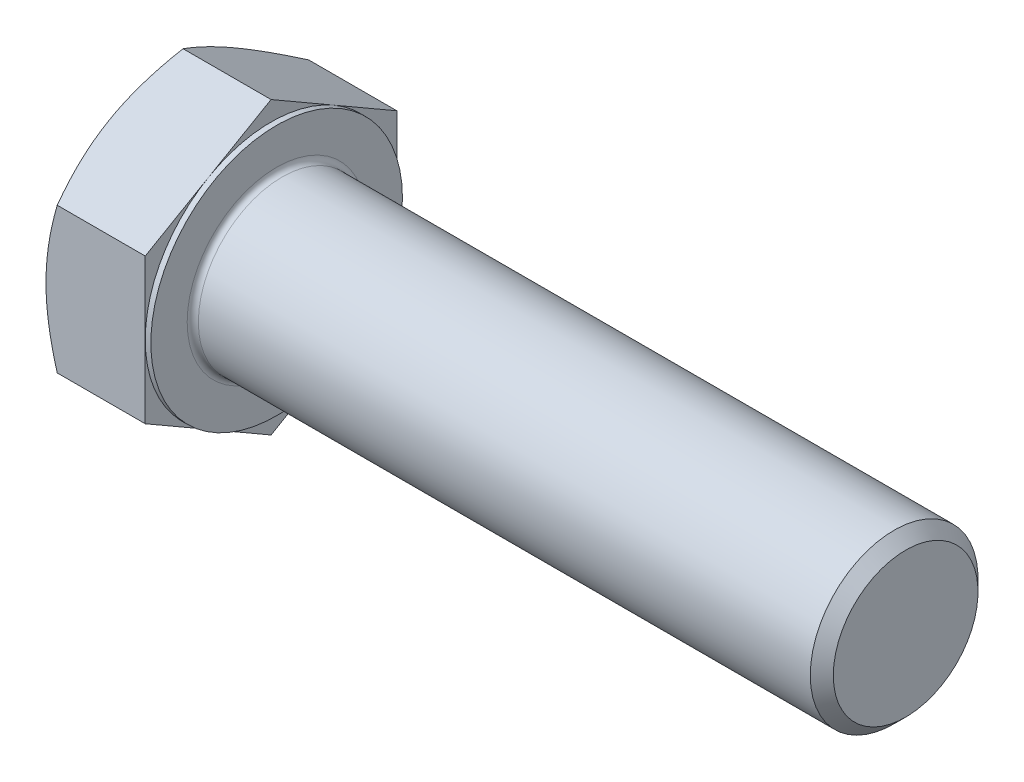
ISO-10303-21;
HEADER;
FILE_DESCRIPTION(('STEP AP214'),'2;1');
FILE_NAME('part.step','',(''),(''),'','','');
FILE_SCHEMA(('AUTOMOTIVE_DESIGN { 1 0 10303 214 1 1 1 1 }'));
ENDSEC;
DATA;
#1=APPLICATION_CONTEXT('core data for automotive mechanical design processes');
#2=APPLICATION_PROTOCOL_DEFINITION('international standard','automotive_design',2000,#1);
#3=PRODUCT_CONTEXT('',#1,'mechanical');
#4=PRODUCT('Part','Part','',(#3));
#5=PRODUCT_RELATED_PRODUCT_CATEGORY('part','',(#4));
#6=PRODUCT_DEFINITION_FORMATION('','',#4);
#7=PRODUCT_DEFINITION_CONTEXT('part definition',#1,'design');
#8=PRODUCT_DEFINITION('design','',#6,#7);
#9=PRODUCT_DEFINITION_SHAPE('','',#8);
#10=(LENGTH_UNIT() NAMED_UNIT(*) SI_UNIT(.MILLI.,.METRE.));
#11=(NAMED_UNIT(*) PLANE_ANGLE_UNIT() SI_UNIT($,.RADIAN.));
#12=(NAMED_UNIT(*) SI_UNIT($,.STERADIAN.) SOLID_ANGLE_UNIT());
#13=UNCERTAINTY_MEASURE_WITH_UNIT(LENGTH_MEASURE(1.E-05),#10,'distance_accuracy_value','');
#14=(GEOMETRIC_REPRESENTATION_CONTEXT(3) GLOBAL_UNCERTAINTY_ASSIGNED_CONTEXT((#13)) GLOBAL_UNIT_ASSIGNED_CONTEXT((#10,
#11,#12)) REPRESENTATION_CONTEXT('',''));
#15=CARTESIAN_POINT('',(0.,0.,0.));
#16=DIRECTION('',(0.,0.,1.));
#17=DIRECTION('',(1.,0.,0.));
#18=AXIS2_PLACEMENT_3D('',#15,#16,#17);
#19=CARTESIAN_POINT('',(9.0556296058918,14.1078379607395,8.99237065564875));
#20=DIRECTION('',(1.,0.,0.));
#21=DIRECTION('',(0.,0.,-1.));
#22=AXIS2_PLACEMENT_3D('',#19,#20,#21);
#23=PLANE('',#22);
#24=CARTESIAN_POINT('',(9.0556296058918,11.5097617493862,8.99237065564875));
#25=DIRECTION('',(1.,0.,0.));
#26=DIRECTION('',(0.,0.,-1.));
#27=AXIS2_PLACEMENT_3D('',#24,#25,#26);
#28=CIRCLE('',#27,1.6);
#29=CARTESIAN_POINT('',(9.0556296058918,11.5097617493862,7.39237065564875));
#30=VERTEX_POINT('',#29);
#31=EDGE_CURVE('E45',#30,#30,#28,.F.);
#32=ORIENTED_EDGE('',*,*,#31,.T.);
#33=EDGE_LOOP('',(#32));
#34=FACE_BOUND('',#33,.T.);
#35=CARTESIAN_POINT('',(9.0556296058918,11.5097617493862,8.99237065564875));
#36=DIRECTION('',(1.,0.,0.));
#37=DIRECTION('',(0.,0.,-1.));
#38=AXIS2_PLACEMENT_3D('',#35,#36,#37);
#39=CIRCLE('',#38,2.25);
#40=CARTESIAN_POINT('',(9.0556296058918,11.5097617493862,6.74237065564875));
#41=VERTEX_POINT('',#40);
#42=EDGE_CURVE('E296',#41,#41,#39,.T.);
#43=ORIENTED_EDGE('',*,*,#42,.T.);
#44=EDGE_LOOP('',(#43));
#45=FACE_BOUND('',#44,.T.);
#46=ADVANCED_FACE('F37',(#34,#45),#23,.T.);
#47=CARTESIAN_POINT('',(7.1806296058918,11.5097617493862,8.99237065564875));
#48=DIRECTION('',(-1.,0.,0.));
#49=DIRECTION('',(0.,0.,1.));
#50=AXIS2_PLACEMENT_3D('',#47,#48,#49);
#51=CYLINDRICAL_SURFACE('',#50,1.5);
#52=CARTESIAN_POINT('',(9.15562960589179,11.5097617493862,8.99237065564875));
#53=DIRECTION('',(1.,0.,0.));
#54=DIRECTION('',(0.,0.,-1.));
#55=AXIS2_PLACEMENT_3D('',#52,#53,#54);
#56=CIRCLE('',#55,1.5);
#57=CARTESIAN_POINT('',(9.15562960589179,11.5097617493862,7.49237065564875));
#58=VERTEX_POINT('',#57);
#59=EDGE_CURVE('E11',#58,#58,#56,.T.);
#60=ORIENTED_EDGE('',*,*,#59,.T.);
#61=EDGE_LOOP('',(#60));
#62=FACE_BOUND('',#61,.T.);
#63=CARTESIAN_POINT('',(20.0996296058918,11.5097617493862,8.99237065564875));
#64=DIRECTION('',(-1.,0.,0.));
#65=DIRECTION('',(0.,0.,1.));
#66=AXIS2_PLACEMENT_3D('',#63,#64,#65);
#67=CIRCLE('',#66,1.5);
#68=CARTESIAN_POINT('',(20.0996296058918,11.5097617493862,10.4923706556488));
#69=VERTEX_POINT('',#68);
#70=EDGE_CURVE('E275',#69,#69,#67,.T.);
#71=ORIENTED_EDGE('',*,*,#70,.T.);
#72=EDGE_LOOP('',(#71));
#73=FACE_BOUND('',#72,.T.);
#74=ADVANCED_FACE('F249',(#62,#73),#51,.T.);
#75=CARTESIAN_POINT('',(20.3056296058918,11.5097617493862,8.99237065564875));
#76=DIRECTION('',(-1.,0.,0.));
#77=DIRECTION('',(0.,0.,1.));
#78=AXIS2_PLACEMENT_3D('',#75,#76,#77);
#79=CONICAL_SURFACE('',#78,1.294,0.785398163397449);
#80=ORIENTED_EDGE('',*,*,#70,.F.);
#81=EDGE_LOOP('',(#80));
#82=FACE_BOUND('',#81,.T.);
#83=CARTESIAN_POINT('',(20.3056296058918,11.5097617493862,8.99237065564875));
#84=DIRECTION('',(-1.,0.,0.));
#85=DIRECTION('',(0.,0.,1.));
#86=AXIS2_PLACEMENT_3D('',#83,#84,#85);
#87=CIRCLE('',#86,1.294);
#88=CARTESIAN_POINT('',(20.3056296058918,11.5097617493862,10.2863706556488));
#89=VERTEX_POINT('',#88);
#90=EDGE_CURVE('E273',#89,#89,#87,.T.);
#91=ORIENTED_EDGE('',*,*,#90,.T.);
#92=EDGE_LOOP('',(#91));
#93=FACE_BOUND('',#92,.T.);
#94=ADVANCED_FACE('F254',(#82,#93),#79,.T.);
#95=CARTESIAN_POINT('',(20.3056296058918,11.5097617493862,8.99237065564875));
#96=DIRECTION('',(-1.,0.,0.));
#97=DIRECTION('',(0.,0.,1.));
#98=AXIS2_PLACEMENT_3D('',#95,#96,#97);
#99=PLANE('',#98);
#100=ORIENTED_EDGE('',*,*,#90,.F.);
#101=EDGE_LOOP('',(#100));
#102=FACE_BOUND('',#101,.T.);
#103=ADVANCED_FACE('F261',(#102),#99,.F.);
#104=CARTESIAN_POINT('',(8.9556296058918,13.7597617493862,8.99237065564875));
#105=DIRECTION('',(1.,0.,0.));
#106=DIRECTION('',(0.,0.,-1.));
#107=AXIS2_PLACEMENT_3D('',#104,#105,#106);
#108=PLANE('',#107);
#109=DIRECTION('',(0.,0.500000000000001,0.866025403784438));
#110=VECTOR('',#109,1.);
#111=CARTESIAN_POINT('',(8.9556296058918,12.8087998550629,6.74237065564875));
#112=LINE('',#111,#110);
#113=CARTESIAN_POINT('',(8.9556296058918,12.8087998550629,6.74237065564875));
#114=VERTEX_POINT('',#113);
#115=CARTESIAN_POINT('',(8.9556296058918,13.4583189079012,7.86737065564875));
#116=VERTEX_POINT('',#115);
#117=EDGE_CURVE('E169',#114,#116,#112,.T.);
#118=ORIENTED_EDGE('',*,*,#117,.T.);
#119=CARTESIAN_POINT('',(8.9556296058918,11.5097617493862,8.99237065564875));
#120=DIRECTION('',(-1.,0.,0.));
#121=DIRECTION('',(0.,0.,1.));
#122=AXIS2_PLACEMENT_3D('',#119,#120,#121);
#123=CIRCLE('',#122,2.25);
#124=CARTESIAN_POINT('',(8.9556296058918,11.5097617493862,6.74237065564875));
#125=VERTEX_POINT('',#124);
#126=EDGE_CURVE('E52',#116,#125,#123,.T.);
#127=ORIENTED_EDGE('',*,*,#126,.T.);
#128=DIRECTION('',(0.,1.,0.));
#129=VECTOR('',#128,1.);
#130=CARTESIAN_POINT('',(8.9556296058918,12.8087998550629,6.74237065564875));
#131=LINE('',#130,#129);
#132=EDGE_CURVE('E299',#125,#114,#131,.T.);
#133=ORIENTED_EDGE('',*,*,#132,.T.);
#134=EDGE_LOOP('',(#118,#127,#133));
#135=FACE_BOUND('',#134,.T.);
#136=ADVANCED_FACE('F264',(#135),#108,.T.);
#137=CARTESIAN_POINT('',(8.9556296058918,14.1078379607395,8.99237065564875));
#138=VERTEX_POINT('',#137);
#139=EDGE_CURVE('E167',#116,#138,#112,.T.);
#140=ORIENTED_EDGE('',*,*,#139,.T.);
#141=DIRECTION('',(0.,-0.500000000000001,0.866025403784438));
#142=VECTOR('',#141,1.);
#143=CARTESIAN_POINT('',(8.9556296058918,14.1078379607395,8.99237065564875));
#144=LINE('',#143,#142);
#145=CARTESIAN_POINT('',(8.9556296058918,13.4583189079012,10.1173706556488));
#146=VERTEX_POINT('',#145);
#147=EDGE_CURVE('E166',#138,#146,#144,.T.);
#148=ORIENTED_EDGE('',*,*,#147,.T.);
#149=EDGE_CURVE('E155',#146,#116,#123,.T.);
#150=ORIENTED_EDGE('',*,*,#149,.T.);
#151=EDGE_LOOP('',(#140,#148,#150));
#152=FACE_BOUND('',#151,.T.);
#153=ADVANCED_FACE('F269',(#152),#108,.T.);
#154=CARTESIAN_POINT('',(8.9556296058918,12.8087998550629,11.2423706556488));
#155=VERTEX_POINT('',#154);
#156=EDGE_CURVE('E134',#146,#155,#144,.T.);
#157=ORIENTED_EDGE('',*,*,#156,.T.);
#158=DIRECTION('',(0.,-1.,0.));
#159=VECTOR('',#158,1.);
#160=CARTESIAN_POINT('',(8.9556296058918,12.8087998550629,11.2423706556488));
#161=LINE('',#160,#159);
#162=CARTESIAN_POINT('',(8.9556296058918,11.5097617493862,11.2423706556488));
#163=VERTEX_POINT('',#162);
#164=EDGE_CURVE('E128',#155,#163,#161,.T.);
#165=ORIENTED_EDGE('',*,*,#164,.T.);
#166=EDGE_CURVE('E132',#163,#146,#123,.T.);
#167=ORIENTED_EDGE('',*,*,#166,.T.);
#168=EDGE_LOOP('',(#157,#165,#167));
#169=FACE_BOUND('',#168,.T.);
#170=ADVANCED_FACE('F130',(#169),#108,.T.);
#171=CARTESIAN_POINT('',(8.9556296058918,10.2107236437096,11.2423706556488));
#172=VERTEX_POINT('',#171);
#173=EDGE_CURVE('E138',#163,#172,#161,.T.);
#174=ORIENTED_EDGE('',*,*,#173,.T.);
#175=DIRECTION('',(0.,-0.500000000000002,-0.866025403784438));
#176=VECTOR('',#175,1.);
#177=CARTESIAN_POINT('',(8.9556296058918,8.91168553803289,8.99237065564875));
#178=LINE('',#177,#176);
#179=CARTESIAN_POINT('',(8.9556296058918,9.56120459087122,10.1173706556488));
#180=VERTEX_POINT('',#179);
#181=EDGE_CURVE('E145',#172,#180,#178,.T.);
#182=ORIENTED_EDGE('',*,*,#181,.T.);
#183=EDGE_CURVE('E142',#180,#163,#123,.T.);
#184=ORIENTED_EDGE('',*,*,#183,.T.);
#185=EDGE_LOOP('',(#174,#182,#184));
#186=FACE_BOUND('',#185,.T.);
#187=ADVANCED_FACE('F143',(#186),#108,.T.);
#188=CARTESIAN_POINT('',(8.9556296058918,8.91168553803289,8.99237065564875));
#189=VERTEX_POINT('',#188);
#190=EDGE_CURVE('E161',#180,#189,#178,.T.);
#191=ORIENTED_EDGE('',*,*,#190,.T.);
#192=DIRECTION('',(0.,0.5,-0.866025403784439));
#193=VECTOR('',#192,1.);
#194=CARTESIAN_POINT('',(8.9556296058918,10.2107236437095,6.74237065564875));
#195=LINE('',#194,#193);
#196=CARTESIAN_POINT('',(8.9556296058918,9.56120459087122,7.86737065564876));
#197=VERTEX_POINT('',#196);
#198=EDGE_CURVE('E337',#189,#197,#195,.T.);
#199=ORIENTED_EDGE('',*,*,#198,.T.);
#200=EDGE_CURVE('E149',#197,#180,#123,.T.);
#201=ORIENTED_EDGE('',*,*,#200,.T.);
#202=EDGE_LOOP('',(#191,#199,#201));
#203=FACE_BOUND('',#202,.T.);
#204=ADVANCED_FACE('F338',(#203),#108,.T.);
#205=CARTESIAN_POINT('',(8.9556296058918,10.2107236437095,6.74237065564875));
#206=VERTEX_POINT('',#205);
#207=EDGE_CURVE('E156',#197,#206,#195,.T.);
#208=ORIENTED_EDGE('',*,*,#207,.T.);
#209=EDGE_CURVE('E300',#206,#125,#131,.T.);
#210=ORIENTED_EDGE('',*,*,#209,.T.);
#211=EDGE_CURVE('E307',#125,#197,#123,.T.);
#212=ORIENTED_EDGE('',*,*,#211,.T.);
#213=EDGE_LOOP('',(#208,#210,#212));
#214=FACE_BOUND('',#213,.T.);
#215=ADVANCED_FACE('F270',(#214),#108,.T.);
#216=CARTESIAN_POINT('',(7.1806296058918,11.5097617493862,8.99237065564875));
#217=DIRECTION('',(-1.,0.,0.));
#218=DIRECTION('',(0.,0.,1.));
#219=AXIS2_PLACEMENT_3D('',#216,#217,#218);
#220=CYLINDRICAL_SURFACE('',#219,2.25);
#221=ORIENTED_EDGE('',*,*,#126,.F.);
#222=ORIENTED_EDGE('',*,*,#149,.F.);
#223=ORIENTED_EDGE('',*,*,#166,.F.);
#224=ORIENTED_EDGE('',*,*,#183,.F.);
#225=ORIENTED_EDGE('',*,*,#200,.F.);
#226=ORIENTED_EDGE('',*,*,#211,.F.);
#227=EDGE_LOOP('',(#221,#222,#223,#224,#225,#226));
#228=FACE_BOUND('',#227,.T.);
#229=ORIENTED_EDGE('',*,*,#42,.F.);
#230=EDGE_LOOP('',(#229));
#231=FACE_BOUND('',#230,.T.);
#232=ADVANCED_FACE('F152',(#228,#231),#220,.T.);
#233=CARTESIAN_POINT('',(7.1806296058918,14.1078379607395,8.99237065564875));
#234=DIRECTION('',(1.,0.,0.));
#235=DIRECTION('',(0.,0.,-1.));
#236=AXIS2_PLACEMENT_3D('',#233,#234,#235);
#237=PLANE('',#236);
#238=CARTESIAN_POINT('',(7.1806296058918,11.5097617493862,8.99237065564875));
#239=DIRECTION('',(1.,0.,0.));
#240=DIRECTION('',(0.,0.,-1.));
#241=AXIS2_PLACEMENT_3D('',#238,#239,#240);
#242=CIRCLE('',#241,2.25);
#243=CARTESIAN_POINT('',(7.1806296058918,11.5097617493862,6.74237065564875));
#244=VERTEX_POINT('',#243);
#245=CARTESIAN_POINT('',(7.1806296058918,13.4583189079012,7.86737065564875));
#246=VERTEX_POINT('',#245);
#247=EDGE_CURVE('E295',#244,#246,#242,.T.);
#248=ORIENTED_EDGE('',*,*,#247,.F.);
#249=CARTESIAN_POINT('',(7.1806296058918,9.56120459087122,7.86737065564876));
#250=VERTEX_POINT('',#249);
#251=EDGE_CURVE('E291',#250,#244,#242,.T.);
#252=ORIENTED_EDGE('',*,*,#251,.F.);
#253=CARTESIAN_POINT('',(7.1806296058918,9.56120459087122,10.1173706556488));
#254=VERTEX_POINT('',#253);
#255=EDGE_CURVE('E294',#254,#250,#242,.T.);
#256=ORIENTED_EDGE('',*,*,#255,.F.);
#257=CARTESIAN_POINT('',(7.1806296058918,11.5097617493862,11.2423706556488));
#258=VERTEX_POINT('',#257);
#259=EDGE_CURVE('E330',#258,#254,#242,.T.);
#260=ORIENTED_EDGE('',*,*,#259,.F.);
#261=CARTESIAN_POINT('',(7.1806296058918,11.5097617493862,8.99237065564875));
#262=DIRECTION('',(-1.,0.,0.));
#263=DIRECTION('',(0.,0.,1.));
#264=AXIS2_PLACEMENT_3D('',#261,#262,#263);
#265=CIRCLE('',#264,2.25);
#266=CARTESIAN_POINT('',(7.1806296058918,13.4583189079012,10.1173706556488));
#267=VERTEX_POINT('',#266);
#268=EDGE_CURVE('E170',#258,#267,#265,.T.);
#269=ORIENTED_EDGE('',*,*,#268,.T.);
#270=EDGE_CURVE('E353',#246,#267,#242,.T.);
#271=ORIENTED_EDGE('',*,*,#270,.F.);
#272=EDGE_LOOP('',(#248,#252,#256,#260,#269,#271));
#273=FACE_BOUND('',#272,.T.);
#274=ADVANCED_FACE('F199',(#273),#237,.F.);
#275=CARTESIAN_POINT('',(7.1806296058918,11.5097617493862,8.99237065564875));
#276=DIRECTION('',(1.,0.,0.));
#277=DIRECTION('',(0.,0.,-1.));
#278=AXIS2_PLACEMENT_3D('',#275,#276,#277);
#279=CONICAL_SURFACE('',#278,2.25,1.0471975511966);
#280=CARTESIAN_POINT('',(7.38159983361791,12.8087854213061,11.2423956556488));
#281=CARTESIAN_POINT('',(7.34863163742218,12.8658705223681,11.1435213602543));
#282=CARTESIAN_POINT('',(7.31864868387197,12.9234483806737,11.043793584278));
#283=CARTESIAN_POINT('',(7.26631409903957,13.0396010392435,10.8426112782009));
#284=CARTESIAN_POINT('',(7.24398098014397,13.0981779027909,10.7411531743887));
#285=CARTESIAN_POINT('',(7.20921754220749,13.2146057088668,10.5394942988515));
#286=CARTESIAN_POINT('',(7.19655583180889,13.2724387415111,10.4393245479557));
#287=CARTESIAN_POINT('',(7.18144265123784,13.3883768169847,10.2385139107038));
#288=CARTESIAN_POINT('',(7.17897866364373,13.4464814386416,10.1378737538394));
#289=CARTESIAN_POINT('',(7.18411506433375,13.5550455933629,9.94983512198139));
#290=CARTESIAN_POINT('',(7.19045429520481,13.6055214094721,9.86240844392673));
#291=CARTESIAN_POINT('',(7.21054268844166,13.7061442049756,9.68812464971499));
#292=CARTESIAN_POINT('',(7.22429870760976,13.7562908365487,9.60126813600193));
#293=CARTESIAN_POINT('',(7.25868641373916,13.8571209591576,9.42662524070999));
#294=CARTESIAN_POINT('',(7.27946381381779,13.9077916938754,9.33886095372186));
#295=CARTESIAN_POINT('',(7.32661985113778,14.0083775863117,9.1646410774975));
#296=CARTESIAN_POINT('',(7.35298741421832,14.0582940318641,9.0781832576676));
#297=CARTESIAN_POINT('',(7.38159983361791,14.1078523944963,8.99234565564875));
#298=B_SPLINE_CURVE_WITH_KNOTS('',3,(#280,#281,#282,#283,#284,#285,#286,#287,#288,#289,#290,
#291,#292,#293,#294,#295,#296,#297),.UNSPECIFIED.,.F.,.F.,(4,2,2,2,2,2,2,2,4),(0.,
0.35664498952014,0.714147051319708,1.06280185173742,1.41102856090748,1.71419159138626,
2.01763537711832,2.32780848597824,2.6373727867413),.UNSPECIFIED.);
#299=CARTESIAN_POINT('',(7.38159150021514,14.1078379607395,8.99237065564875));
#300=VERTEX_POINT('',#299);
#301=EDGE_CURVE('E218',#267,#300,#298,.T.);
#302=ORIENTED_EDGE('',*,*,#301,.T.);
#303=CARTESIAN_POINT('',(7.38159983361791,14.1078523944963,8.99239565564875));
#304=CARTESIAN_POINT('',(7.34863163742218,14.0507672934343,8.89352136025429));
#305=CARTESIAN_POINT('',(7.31864868387197,13.9931894351287,8.79379358427799));
#306=CARTESIAN_POINT('',(7.26631409903957,13.8770367765589,8.59261127820086));
#307=CARTESIAN_POINT('',(7.24398098014397,13.8184599130115,8.49115317438866));
#308=CARTESIAN_POINT('',(7.20921754220749,13.7020321069356,8.28949429885155));
#309=CARTESIAN_POINT('',(7.19655583180889,13.6441990742913,8.18932454795573));
#310=CARTESIAN_POINT('',(7.18144265123784,13.5282609988177,7.98851391070375));
#311=CARTESIAN_POINT('',(7.17897866364373,13.4701563771608,7.8878737538394));
#312=CARTESIAN_POINT('',(7.18411506433375,13.3615922224395,7.69983512198139));
#313=CARTESIAN_POINT('',(7.19045429520481,13.3111164063303,7.61240844392673));
#314=CARTESIAN_POINT('',(7.21054268844165,13.2104936108268,7.43812464971499));
#315=CARTESIAN_POINT('',(7.22429870760976,13.1603469792537,7.35126813600193));
#316=CARTESIAN_POINT('',(7.25868641373916,13.0595168566448,7.17662524070999));
#317=CARTESIAN_POINT('',(7.27946381381779,13.008846121927,7.08886095372186));
#318=CARTESIAN_POINT('',(7.32661985113777,12.9082602294906,6.9146410774975));
#319=CARTESIAN_POINT('',(7.35298741421831,12.8583437839383,6.8281832576676));
#320=CARTESIAN_POINT('',(7.38159983361791,12.8087854213061,6.74234565564875));
#321=B_SPLINE_CURVE_WITH_KNOTS('',3,(#303,#304,#305,#306,#307,#308,#309,#310,#311,#312,#313,
#314,#315,#316,#317,#318,#319,#320),.UNSPECIFIED.,.F.,.F.,(4,2,2,2,2,2,2,2,4),(0.,
0.35664498952014,0.714147051319706,1.06280185173742,1.41102856090749,1.71419159138626,
2.01763537711832,2.32780848597824,2.6373727867413),.UNSPECIFIED.);
#322=EDGE_CURVE('E60',#300,#246,#321,.T.);
#323=ORIENTED_EDGE('',*,*,#322,.T.);
#324=ORIENTED_EDGE('',*,*,#270,.T.);
#325=EDGE_LOOP('',(#302,#323,#324));
#326=FACE_BOUND('',#325,.T.);
#327=ADVANCED_FACE('F354',(#326),#279,.T.);
#328=CARTESIAN_POINT('',(8.2816829972038,8.01421921899813,11.2423706556488));
#329=CARTESIAN_POINT('',(8.23396324497244,8.11254122294307,11.2423706556488));
#330=CARTESIAN_POINT('',(8.18669925747915,8.21108826595331,11.2423706556488));
#331=CARTESIAN_POINT('',(8.09333900976152,8.40875207487812,11.2423706556488));
#332=CARTESIAN_POINT('',(8.04724293233795,8.50786892703649,11.2423706556488));
#333=CARTESIAN_POINT('',(7.95624410438723,8.70729974414911,11.2423706556488));
#334=CARTESIAN_POINT('',(7.91134916344165,8.80761728485529,11.2423706556488));
#335=CARTESIAN_POINT('',(7.82338822703098,9.00904807446457,11.2423706556488));
#336=CARTESIAN_POINT('',(7.78032214558323,9.11016128569422,11.2423706556488));
#337=CARTESIAN_POINT('',(7.6951434345523,9.31663629406716,11.2423706556488));
#338=CARTESIAN_POINT('',(7.65310685090656,9.42202963458255,11.2423706556488));
#339=CARTESIAN_POINT('',(7.57220026621262,9.63404710677843,11.2423706556488));
#340=CARTESIAN_POINT('',(7.53333061971775,9.74067137474556,11.2423706556488));
#341=CARTESIAN_POINT('',(7.45977380669059,9.95512269998946,11.2423706556488));
#342=CARTESIAN_POINT('',(7.42507822555397,10.062946841882,11.2423706556488));
#343=CARTESIAN_POINT('',(7.36097884937975,10.2801418986523,11.2423706556488));
#344=CARTESIAN_POINT('',(7.33157339402775,10.3895123165647,11.2423706556488));
#345=CARTESIAN_POINT('',(7.279618931906,10.6092509744679,11.2423706556488));
#346=CARTESIAN_POINT('',(7.25703236731802,10.7196101682207,11.2423706556488));
#347=CARTESIAN_POINT('',(7.21998696038562,10.9417075865322,11.2423706556488));
#348=CARTESIAN_POINT('',(7.20552734050285,11.0534456781204,11.2423706556488));
#349=CARTESIAN_POINT('',(7.18607834791785,11.2762807530927,11.2423706556488));
#350=CARTESIAN_POINT('',(7.18096677042786,11.3873668016471,11.2423706556488));
#351=CARTESIAN_POINT('',(7.18032515061975,11.6095759555107,11.2423706556488));
#352=CARTESIAN_POINT('',(7.18479526896524,11.7206990614101,11.2423706556488));
#353=CARTESIAN_POINT('',(7.20018622534447,11.9091716486395,11.2423706556488));
#354=CARTESIAN_POINT('',(7.20878911117898,11.9867222156485,11.2423706556488));
#355=CARTESIAN_POINT('',(7.2301290490419,12.1412578386158,11.2423706556488));
#356=CARTESIAN_POINT('',(7.24286665816447,12.2182428169392,11.2423706556488));
#357=CARTESIAN_POINT('',(7.28661428375152,12.4482356851717,11.2423706556488));
#358=CARTESIAN_POINT('',(7.3231511529983,12.6001955985478,11.2423706556488));
#359=CARTESIAN_POINT('',(7.40792674071901,12.9043253893549,11.2423706556488));
#360=CARTESIAN_POINT('',(7.45640673925502,13.0564253561261,11.2423706556488));
#361=CARTESIAN_POINT('',(7.53501080346695,13.2824627844219,11.2423706556488));
#362=CARTESIAN_POINT('',(7.56218978976073,13.3574490299023,11.2423706556488));
#363=CARTESIAN_POINT('',(7.61820094186111,13.5068015117595,11.2423706556488));
#364=CARTESIAN_POINT('',(7.64703308865169,13.5811677552568,11.2423706556488));
#365=CARTESIAN_POINT('',(7.71670635704548,13.75603989655,11.2423706556488));
#366=CARTESIAN_POINT('',(7.75813213442674,13.8563121644283,11.2423706556488));
#367=CARTESIAN_POINT('',(7.84299410115918,14.0560044862293,11.2423706556488));
#368=CARTESIAN_POINT('',(7.88643040528939,14.155424491112,11.2423706556488));
#369=CARTESIAN_POINT('',(8.01913358821998,14.4526598209336,11.2423706556488));
#370=CARTESIAN_POINT('',(8.11077892269159,14.6494117573678,11.2423706556488));
#371=CARTESIAN_POINT('',(8.29827711329478,15.0411243042311,11.2423706556488));
#372=CARTESIAN_POINT('',(8.39413415539697,15.2360828884519,11.2423706556488));
#373=CARTESIAN_POINT('',(8.58867832815416,15.6245882192409,11.2423706556488));
#374=CARTESIAN_POINT('',(8.68736556266179,15.8181349136726,11.2423706556488));
#375=CARTESIAN_POINT('',(8.87840883934971,16.1880596913262,11.2423706556488));
#376=CARTESIAN_POINT('',(8.970604716269,16.3645207809762,11.2423706556488));
#377=CARTESIAN_POINT('',(9.15626230658982,16.7167830280554,11.2423706556488));
#378=CARTESIAN_POINT('',(9.2497240645305,16.8925841619852,11.2423706556488));
#379=CARTESIAN_POINT('',(9.4373782194553,17.2432325453967,11.2423706556488));
#380=CARTESIAN_POINT('',(9.53156821864795,17.4180810800024,11.2423706556488));
#381=CARTESIAN_POINT('',(9.72070564228345,17.767355691557,11.2423706556488));
#382=CARTESIAN_POINT('',(9.81565302457233,17.9417817913229,11.2423706556488));
#383=CARTESIAN_POINT('',(9.91088318982587,18.1160522788663,11.2423706556488));
#384=B_SPLINE_CURVE_WITH_KNOTS('',3,(#328,#329,#330,#331,#332,#333,#334,#335,#336,#337,#338,
#339,#340,#341,#342,#343,#344,#345,#346,#347,#348,#349,#350,#351,#352,#353,#354,#355,#356,#357,
#358,#359,#360,#361,#362,#363,#364,#365,#366,#367,#368,#369,#370,#371,#372,#373,#374,#375,#376,
#377,#378,#379,#380,#381,#382,#383),.UNSPECIFIED.,.F.,.F.,(4,2,2,2,2,2,2,2,2,2,2,2,2,2,2,2,2,2,
2,2,2,2,2,2,2,2,2,4),(0.,0.327875171924574,0.655801349600486,0.985502487384209,1.31518810728021,
1.65555070165062,1.99595134898709,2.33565384754083,2.67524954321556,3.01293913956602,
3.35059642225715,3.68380714348432,4.01702345195405,4.25098980294671,4.48498769061463,
4.9532410879721,5.43186675837461,5.67113120230288,5.9103928945643,6.23584150180035,
6.56130871155165,7.21236849335618,7.86409067964356,8.515836811259,9.11311415914918,
9.71041257669622,10.3062242066031,10.9020029034079),.UNSPECIFIED.);
#385=CARTESIAN_POINT('',(7.38159150021514,12.8087998550629,11.2423706556488));
#386=VERTEX_POINT('',#385);
#387=EDGE_CURVE('E230',#258,#386,#384,.T.);
#388=ORIENTED_EDGE('',*,*,#387,.T.);
#389=EDGE_CURVE('E229',#386,#267,#298,.T.);
#390=ORIENTED_EDGE('',*,*,#389,.T.);
#391=ORIENTED_EDGE('',*,*,#268,.F.);
#392=EDGE_LOOP('',(#388,#390,#391));
#393=FACE_BOUND('',#392,.T.);
#394=ADVANCED_FACE('F324',(#393),#279,.T.);
#395=CARTESIAN_POINT('',(7.38159150021513,10.2107236437096,11.2423706556488));
#396=VERTEX_POINT('',#395);
#397=EDGE_CURVE('E276',#396,#258,#384,.T.);
#398=ORIENTED_EDGE('',*,*,#397,.T.);
#399=ORIENTED_EDGE('',*,*,#259,.T.);
#400=CARTESIAN_POINT('',(7.38159983361791,8.91167110427616,8.99234565564875));
#401=CARTESIAN_POINT('',(7.34863163742219,8.96875620533809,9.09121995104322));
#402=CARTESIAN_POINT('',(7.31864868387197,9.02633406364369,9.19094772701952));
#403=CARTESIAN_POINT('',(7.26631409903957,9.14248672221351,9.39213003309665));
#404=CARTESIAN_POINT('',(7.24398098014397,9.20106358576095,9.49358813690884));
#405=CARTESIAN_POINT('',(7.20921754220749,9.31749139183678,9.69524701244596));
#406=CARTESIAN_POINT('',(7.19655583180889,9.37532442448114,9.79541676334178));
#407=CARTESIAN_POINT('',(7.18144265123784,9.49126249995471,9.99622740059376));
#408=CARTESIAN_POINT('',(7.17897866364373,9.54936712161163,10.0968675574581));
#409=CARTESIAN_POINT('',(7.18411506433375,9.65793127633291,10.2849061893161));
#410=CARTESIAN_POINT('',(7.1904542952048,9.70840709244212,10.3723328673708));
#411=CARTESIAN_POINT('',(7.21054268844165,9.80902988794566,10.5466166615825));
#412=CARTESIAN_POINT('',(7.22429870760976,9.85917651951876,10.6334731752956));
#413=CARTESIAN_POINT('',(7.25868641373916,9.96000664212762,10.8081160705875));
#414=CARTESIAN_POINT('',(7.27946381381779,10.0106773768455,10.8958803575756));
#415=CARTESIAN_POINT('',(7.32661985113777,10.1112632692818,11.0701002338));
#416=CARTESIAN_POINT('',(7.35298741421831,10.1611797148341,11.1565580536299));
#417=CARTESIAN_POINT('',(7.38159983361791,10.2107380774663,11.2423956556488));
#418=B_SPLINE_CURVE_WITH_KNOTS('',3,(#400,#401,#402,#403,#404,#405,#406,#407,#408,#409,#410,
#411,#412,#413,#414,#415,#416,#417),.UNSPECIFIED.,.F.,.F.,(4,2,2,2,2,2,2,2,4),(0.,
0.356644989520138,0.714147051319704,1.06280185173742,1.41102856090749,1.71419159138626,
2.01763537711832,2.32780848597824,2.6373727867413),.UNSPECIFIED.);
#419=EDGE_CURVE('E220',#254,#396,#418,.T.);
#420=ORIENTED_EDGE('',*,*,#419,.T.);
#421=EDGE_LOOP('',(#398,#399,#420));
#422=FACE_BOUND('',#421,.T.);
#423=ADVANCED_FACE('F188',(#422),#279,.T.);
#424=CARTESIAN_POINT('',(7.38159150021514,8.91168553803289,8.99237065564875));
#425=VERTEX_POINT('',#424);
#426=EDGE_CURVE('E213',#425,#254,#418,.T.);
#427=ORIENTED_EDGE('',*,*,#426,.T.);
#428=ORIENTED_EDGE('',*,*,#255,.T.);
#429=CARTESIAN_POINT('',(7.38159983361791,10.2107380774663,6.74234565564875));
#430=CARTESIAN_POINT('',(7.34863163742219,10.1536529764043,6.84121995104322));
#431=CARTESIAN_POINT('',(7.31864868387197,10.0960751180988,6.94094772701952));
#432=CARTESIAN_POINT('',(7.26631409903957,9.97992245952893,7.14213003309665));
#433=CARTESIAN_POINT('',(7.24398098014397,9.92134559598149,7.24358813690885));
#434=CARTESIAN_POINT('',(7.20921754220749,9.80491778990566,7.44524701244596));
#435=CARTESIAN_POINT('',(7.19655583180889,9.7470847572613,7.54541676334178));
#436=CARTESIAN_POINT('',(7.18144265123784,9.63114668178773,7.74622740059376));
#437=CARTESIAN_POINT('',(7.17897866364373,9.57304206013081,7.84686755745811));
#438=CARTESIAN_POINT('',(7.18411506433375,9.46447790540954,8.03490618931612));
#439=CARTESIAN_POINT('',(7.19045429520481,9.41400208930033,8.12233286737078));
#440=CARTESIAN_POINT('',(7.21054268844166,9.31337929379679,8.29661666158252));
#441=CARTESIAN_POINT('',(7.22429870760977,9.26323266222368,8.38347317529558));
#442=CARTESIAN_POINT('',(7.25868641373916,9.16240253961482,8.55811607058753));
#443=CARTESIAN_POINT('',(7.27946381381779,9.11173180489699,8.64588035757565));
#444=CARTESIAN_POINT('',(7.32661985113778,9.01114591246067,8.82010023380001));
#445=CARTESIAN_POINT('',(7.35298741421832,8.96122946690833,8.90655805362991));
#446=CARTESIAN_POINT('',(7.38159983361791,8.91167110427616,8.99239565564875));
#447=B_SPLINE_CURVE_WITH_KNOTS('',3,(#429,#430,#431,#432,#433,#434,#435,#436,#437,#438,#439,
#440,#441,#442,#443,#444,#445,#446),.UNSPECIFIED.,.F.,.F.,(4,2,2,2,2,2,2,2,4),(0.,
0.356644989520139,0.714147051319707,1.06280185173742,1.41102856090749,1.71419159138626,
2.01763537711832,2.32780848597824,2.6373727867413),.UNSPECIFIED.);
#448=EDGE_CURVE('E219',#250,#425,#447,.T.);
#449=ORIENTED_EDGE('',*,*,#448,.T.);
#450=EDGE_LOOP('',(#427,#428,#449));
#451=FACE_BOUND('',#450,.T.);
#452=ADVANCED_FACE('F352',(#451),#279,.T.);
#453=CARTESIAN_POINT('',(7.38159150021514,12.8087998550629,6.74237065564875));
#454=VERTEX_POINT('',#453);
#455=EDGE_CURVE('E221',#246,#454,#321,.T.);
#456=ORIENTED_EDGE('',*,*,#455,.T.);
#457=CARTESIAN_POINT('',(8.28168299726364,8.01421921887487,6.74237065564875));
#458=CARTESIAN_POINT('',(8.23396324502978,8.11254122282395,6.74237065564875));
#459=CARTESIAN_POINT('',(8.18669925753398,8.21108826583834,6.74237065564875));
#460=CARTESIAN_POINT('',(8.09333900981137,8.40875207477145,6.74237065564875));
#461=CARTESIAN_POINT('',(8.0472429323853,8.50786892693398,6.74237065564875));
#462=CARTESIAN_POINT('',(7.95624410442961,8.70729974405497,6.74237065564875));
#463=CARTESIAN_POINT('',(7.91134916348153,8.80761728476538,6.74237065564875));
#464=CARTESIAN_POINT('',(7.82338822706592,9.00904807438313,6.74237065564875));
#465=CARTESIAN_POINT('',(7.78032214561573,9.11016128561702,6.74237065564875));
#466=CARTESIAN_POINT('',(7.69514343457983,9.31663629399879,6.74237065564875));
#467=CARTESIAN_POINT('',(7.65310685093159,9.42202963451875,6.74237065564875));
#468=CARTESIAN_POINT('',(7.57220026623276,9.63404710672385,6.74237065564875));
#469=CARTESIAN_POINT('',(7.53333061973553,9.74067137469563,6.74237065564875));
#470=CARTESIAN_POINT('',(7.45977380670385,9.95512269994891,6.74237065564875));
#471=CARTESIAN_POINT('',(7.42507822556509,10.0629468418462,6.74237065564875));
#472=CARTESIAN_POINT('',(7.36097884938694,10.2801418986261,6.74237065564875));
#473=CARTESIAN_POINT('',(7.33157339403315,10.3895123165433,6.74237065564875));
#474=CARTESIAN_POINT('',(7.2796189319078,10.6092509744588,6.74237065564875));
#475=CARTESIAN_POINT('',(7.25703236731816,10.719610168219,6.74237065564875));
#476=CARTESIAN_POINT('',(7.21998696038354,10.9417075865455,6.74237065564875));
#477=CARTESIAN_POINT('',(7.20552734050022,11.0534456781413,6.74237065564875));
#478=CARTESIAN_POINT('',(7.18607834791549,11.2762807531287,6.74237065564875));
#479=CARTESIAN_POINT('',(7.18096677042628,11.3873668016906,6.74237065564875));
#480=CARTESIAN_POINT('',(7.18032515062103,11.609575955569,6.74237065564875));
#481=CARTESIAN_POINT('',(7.1847952689686,11.7206990614757,6.74237065564875));
#482=CARTESIAN_POINT('',(7.200186225352,11.9091716487145,6.74237065564875));
#483=CARTESIAN_POINT('',(7.20878911118817,11.9867222157255,6.74237065564875));
#484=CARTESIAN_POINT('',(7.23012904905451,12.1412578386968,6.74237065564875));
#485=CARTESIAN_POINT('',(7.24286665817883,12.2182428170221,6.74237065564875));
#486=CARTESIAN_POINT('',(7.28661428377118,12.4482356852603,6.74237065564875));
#487=CARTESIAN_POINT('',(7.32315115302153,12.60019559864,6.74237065564875));
#488=CARTESIAN_POINT('',(7.40792674074932,12.9043253894545,6.74237065564875));
#489=CARTESIAN_POINT('',(7.45640673928884,13.0564253562294,6.74237065564875));
#490=CARTESIAN_POINT('',(7.53501080350584,13.2824627845307,6.74237065564875));
#491=CARTESIAN_POINT('',(7.56218978980128,13.357449030013,6.74237065564875));
#492=CARTESIAN_POINT('',(7.61820094190492,13.5068015118738,6.74237065564875));
#493=CARTESIAN_POINT('',(7.64703308869711,13.581167755373,6.74237065564875));
#494=CARTESIAN_POINT('',(7.71670635709341,13.7560398966674,6.74237065564875));
#495=CARTESIAN_POINT('',(7.75813213447547,13.8563121645452,6.74237065564875));
#496=CARTESIAN_POINT('',(7.84299410120935,14.0560044863451,6.74237065564875));
#497=CARTESIAN_POINT('',(7.88643040534017,14.1554244912274,6.74237065564875));
#498=CARTESIAN_POINT('',(8.0191335882724,14.4526598210477,6.74237065564875));
#499=CARTESIAN_POINT('',(8.11077892274482,14.649411757481,6.74237065564875));
#500=CARTESIAN_POINT('',(8.29827711334927,15.0411243043429,6.74237065564875));
#501=CARTESIAN_POINT('',(8.39413415545192,15.2360828885631,6.74237065564876));
#502=CARTESIAN_POINT('',(8.58867832820984,15.6245882193507,6.74237065564876));
#503=CARTESIAN_POINT('',(8.68736556271773,15.8181349137818,6.74237065564876));
#504=CARTESIAN_POINT('',(8.87840883940622,16.1880596914348,6.74237065564876));
#505=CARTESIAN_POINT('',(8.97060471632584,16.3645207810847,6.74237065564876));
#506=CARTESIAN_POINT('',(9.15626230664726,16.7167830281637,6.74237065564876));
#507=CARTESIAN_POINT('',(9.24972406458819,16.8925841620935,6.74237065564876));
#508=CARTESIAN_POINT('',(9.4373782195135,17.243232545505,6.74237065564876));
#509=CARTESIAN_POINT('',(9.5315682187064,17.4180810801107,6.74237065564876));
#510=CARTESIAN_POINT('',(9.72070564234235,17.7673556916654,6.74237065564876));
#511=CARTESIAN_POINT('',(9.81565302463145,17.9417817914313,6.74237065564876));
#512=CARTESIAN_POINT('',(9.91088318988519,18.1160522789749,6.74237065564876));
#513=B_SPLINE_CURVE_WITH_KNOTS('',3,(#457,#458,#459,#460,#461,#462,#463,#464,#465,#466,#467,
#468,#469,#470,#471,#472,#473,#474,#475,#476,#477,#478,#479,#480,#481,#482,#483,#484,#485,#486,
#487,#488,#489,#490,#491,#492,#493,#494,#495,#496,#497,#498,#499,#500,#501,#502,#503,#504,#505,
#506,#507,#508,#509,#510,#511,#512),.UNSPECIFIED.,.F.,.F.,(4,2,2,2,2,2,2,2,2,2,2,2,2,2,2,2,2,2,
2,2,2,2,2,2,2,2,2,4),(0.,0.327875171939029,0.655801349629396,0.985502487427733,1.31518810733835,
1.65555070172428,1.99595134907629,2.3356538476455,2.6752495433357,3.01293913970894,
3.35059642242282,3.68380714367218,4.01702345216412,4.25098980316337,4.48498769083788,
4.95324108820856,5.43186675862482,5.67113120255995,5.91039289482822,6.23584150206374,
6.56130871181449,7.21236849361791,7.86409067990407,8.51583681151829,9.11311415940869,
9.71041257695596,10.3062242068633,10.9020029036686),.UNSPECIFIED.);
#514=EDGE_CURVE('E181',#454,#244,#513,.F.);
#515=ORIENTED_EDGE('',*,*,#514,.T.);
#516=ORIENTED_EDGE('',*,*,#247,.T.);
#517=EDGE_LOOP('',(#456,#515,#516));
#518=FACE_BOUND('',#517,.T.);
#519=ADVANCED_FACE('F349',(#518),#279,.T.);
#520=CARTESIAN_POINT('',(7.38159150021514,10.2107236437095,6.74237065564875));
#521=VERTEX_POINT('',#520);
#522=EDGE_CURVE('E182',#521,#250,#447,.T.);
#523=ORIENTED_EDGE('',*,*,#522,.T.);
#524=ORIENTED_EDGE('',*,*,#251,.T.);
#525=EDGE_CURVE('E173',#244,#521,#513,.F.);
#526=ORIENTED_EDGE('',*,*,#525,.T.);
#527=EDGE_LOOP('',(#523,#524,#526));
#528=FACE_BOUND('',#527,.T.);
#529=ADVANCED_FACE('F197',(#528),#279,.T.);
#530=CARTESIAN_POINT('',(9.0556296058918,12.8087998550629,6.74237065564875));
#531=DIRECTION('',(0.,0.,1.));
#532=DIRECTION('',(0.,-1.,0.));
#533=AXIS2_PLACEMENT_3D('',#530,#531,#532);
#534=PLANE('',#533);
#535=ORIENTED_EDGE('',*,*,#209,.F.);
#536=DIRECTION('',(-1.,0.,0.));
#537=VECTOR('',#536,1.);
#538=CARTESIAN_POINT('',(9.0556296058918,10.2107236437095,6.74237065564875));
#539=LINE('',#538,#537);
#540=EDGE_CURVE('E282',#206,#521,#539,.T.);
#541=ORIENTED_EDGE('',*,*,#540,.T.);
#542=ORIENTED_EDGE('',*,*,#525,.F.);
#543=ORIENTED_EDGE('',*,*,#514,.F.);
#544=DIRECTION('',(-1.,0.,0.));
#545=VECTOR('',#544,1.);
#546=CARTESIAN_POINT('',(9.0556296058918,12.8087998550629,6.74237065564875));
#547=LINE('',#546,#545);
#548=EDGE_CURVE('E278',#114,#454,#547,.T.);
#549=ORIENTED_EDGE('',*,*,#548,.F.);
#550=ORIENTED_EDGE('',*,*,#132,.F.);
#551=EDGE_LOOP('',(#535,#541,#542,#543,#549,#550));
#552=FACE_BOUND('',#551,.T.);
#553=ADVANCED_FACE('F192',(#552),#534,.F.);
#554=CARTESIAN_POINT('',(9.0556296058918,10.2107236437095,6.74237065564875));
#555=DIRECTION('',(0.,0.866025403784439,0.5));
#556=DIRECTION('',(0.,-0.5,0.866025403784439));
#557=AXIS2_PLACEMENT_3D('',#554,#555,#556);
#558=PLANE('',#557);
#559=ORIENTED_EDGE('',*,*,#198,.F.);
#560=DIRECTION('',(-1.,0.,0.));
#561=VECTOR('',#560,1.);
#562=CARTESIAN_POINT('',(9.0556296058918,8.91168553803289,8.99237065564875));
#563=LINE('',#562,#561);
#564=EDGE_CURVE('E284',#189,#425,#563,.T.);
#565=ORIENTED_EDGE('',*,*,#564,.T.);
#566=ORIENTED_EDGE('',*,*,#448,.F.);
#567=ORIENTED_EDGE('',*,*,#522,.F.);
#568=ORIENTED_EDGE('',*,*,#540,.F.);
#569=ORIENTED_EDGE('',*,*,#207,.F.);
#570=EDGE_LOOP('',(#559,#565,#566,#567,#568,#569));
#571=FACE_BOUND('',#570,.T.);
#572=ADVANCED_FACE('F196',(#571),#558,.F.);
#573=CARTESIAN_POINT('',(9.0556296058918,8.91168553803289,8.99237065564875));
#574=DIRECTION('',(0.,0.866025403784437,-0.500000000000002));
#575=DIRECTION('',(0.,0.500000000000002,0.866025403784438));
#576=AXIS2_PLACEMENT_3D('',#573,#574,#575);
#577=PLANE('',#576);
#578=ORIENTED_EDGE('',*,*,#181,.F.);
#579=DIRECTION('',(-1.,0.,0.));
#580=VECTOR('',#579,1.);
#581=CARTESIAN_POINT('',(9.0556296058918,10.2107236437096,11.2423706556488));
#582=LINE('',#581,#580);
#583=EDGE_CURVE('E160',#172,#396,#582,.T.);
#584=ORIENTED_EDGE('',*,*,#583,.T.);
#585=ORIENTED_EDGE('',*,*,#419,.F.);
#586=ORIENTED_EDGE('',*,*,#426,.F.);
#587=ORIENTED_EDGE('',*,*,#564,.F.);
#588=ORIENTED_EDGE('',*,*,#190,.F.);
#589=EDGE_LOOP('',(#578,#584,#585,#586,#587,#588));
#590=FACE_BOUND('',#589,.T.);
#591=ADVANCED_FACE('F204',(#590),#577,.F.);
#592=CARTESIAN_POINT('',(9.0556296058918,12.8087998550629,11.2423706556488));
#593=DIRECTION('',(0.,0.,-1.));
#594=DIRECTION('',(0.,1.,0.));
#595=AXIS2_PLACEMENT_3D('',#592,#593,#594);
#596=PLANE('',#595);
#597=ORIENTED_EDGE('',*,*,#164,.F.);
#598=DIRECTION('',(-1.,0.,0.));
#599=VECTOR('',#598,1.);
#600=CARTESIAN_POINT('',(9.0556296058918,12.8087998550629,11.2423706556488));
#601=LINE('',#600,#599);
#602=EDGE_CURVE('E287',#155,#386,#601,.T.);
#603=ORIENTED_EDGE('',*,*,#602,.T.);
#604=ORIENTED_EDGE('',*,*,#387,.F.);
#605=ORIENTED_EDGE('',*,*,#397,.F.);
#606=ORIENTED_EDGE('',*,*,#583,.F.);
#607=ORIENTED_EDGE('',*,*,#173,.F.);
#608=EDGE_LOOP('',(#597,#603,#604,#605,#606,#607));
#609=FACE_BOUND('',#608,.T.);
#610=ADVANCED_FACE('F158',(#609),#596,.F.);
#611=CARTESIAN_POINT('',(9.0556296058918,14.1078379607395,8.99237065564875));
#612=DIRECTION('',(0.,-0.866025403784438,-0.500000000000001));
#613=DIRECTION('',(0.,0.500000000000001,-0.866025403784438));
#614=AXIS2_PLACEMENT_3D('',#611,#612,#613);
#615=PLANE('',#614);
#616=ORIENTED_EDGE('',*,*,#147,.F.);
#617=DIRECTION('',(-1.,0.,0.));
#618=VECTOR('',#617,1.);
#619=CARTESIAN_POINT('',(9.0556296058918,14.1078379607395,8.99237065564875));
#620=LINE('',#619,#618);
#621=EDGE_CURVE('E289',#138,#300,#620,.T.);
#622=ORIENTED_EDGE('',*,*,#621,.T.);
#623=ORIENTED_EDGE('',*,*,#301,.F.);
#624=ORIENTED_EDGE('',*,*,#389,.F.);
#625=ORIENTED_EDGE('',*,*,#602,.F.);
#626=ORIENTED_EDGE('',*,*,#156,.F.);
#627=EDGE_LOOP('',(#616,#622,#623,#624,#625,#626));
#628=FACE_BOUND('',#627,.T.);
#629=ADVANCED_FACE('F235',(#628),#615,.F.);
#630=CARTESIAN_POINT('',(9.0556296058918,12.8087998550629,6.74237065564875));
#631=DIRECTION('',(0.,-0.866025403784438,0.500000000000001));
#632=DIRECTION('',(0.,-0.500000000000001,-0.866025403784438));
#633=AXIS2_PLACEMENT_3D('',#630,#631,#632);
#634=PLANE('',#633);
#635=ORIENTED_EDGE('',*,*,#117,.F.);
#636=ORIENTED_EDGE('',*,*,#548,.T.);
#637=ORIENTED_EDGE('',*,*,#455,.F.);
#638=ORIENTED_EDGE('',*,*,#322,.F.);
#639=ORIENTED_EDGE('',*,*,#621,.F.);
#640=ORIENTED_EDGE('',*,*,#139,.F.);
#641=EDGE_LOOP('',(#635,#636,#637,#638,#639,#640));
#642=FACE_BOUND('',#641,.T.);
#643=ADVANCED_FACE('F238',(#642),#634,.F.);
#644=CARTESIAN_POINT('',(9.15562960589179,11.5097617493862,8.99237065564875));
#645=DIRECTION('',(1.,0.,0.));
#646=DIRECTION('',(0.,0.,-1.));
#647=AXIS2_PLACEMENT_3D('',#644,#645,#646);
#648=TOROIDAL_SURFACE('',#647,1.6,0.1);
#649=ORIENTED_EDGE('',*,*,#59,.F.);
#650=EDGE_LOOP('',(#649));
#651=FACE_BOUND('',#650,.T.);
#652=ORIENTED_EDGE('',*,*,#31,.F.);
#653=EDGE_LOOP('',(#652));
#654=FACE_BOUND('',#653,.T.);
#655=ADVANCED_FACE('F39',(#651,#654),#648,.F.);
#656=CLOSED_SHELL('',(#46,#74,#94,#103,#136,#153,#170,#187,#204,#215,#232,#274,#327,#394,#423,
#452,#519,#529,#553,#572,#591,#610,#629,#643,#655));
#657=MANIFOLD_SOLID_BREP('B2',#656);
#658=ADVANCED_BREP_SHAPE_REPRESENTATION('',(#18,#657),#14);
#659=SHAPE_DEFINITION_REPRESENTATION(#9,#658);
ENDSEC;
END-ISO-10303-21;
